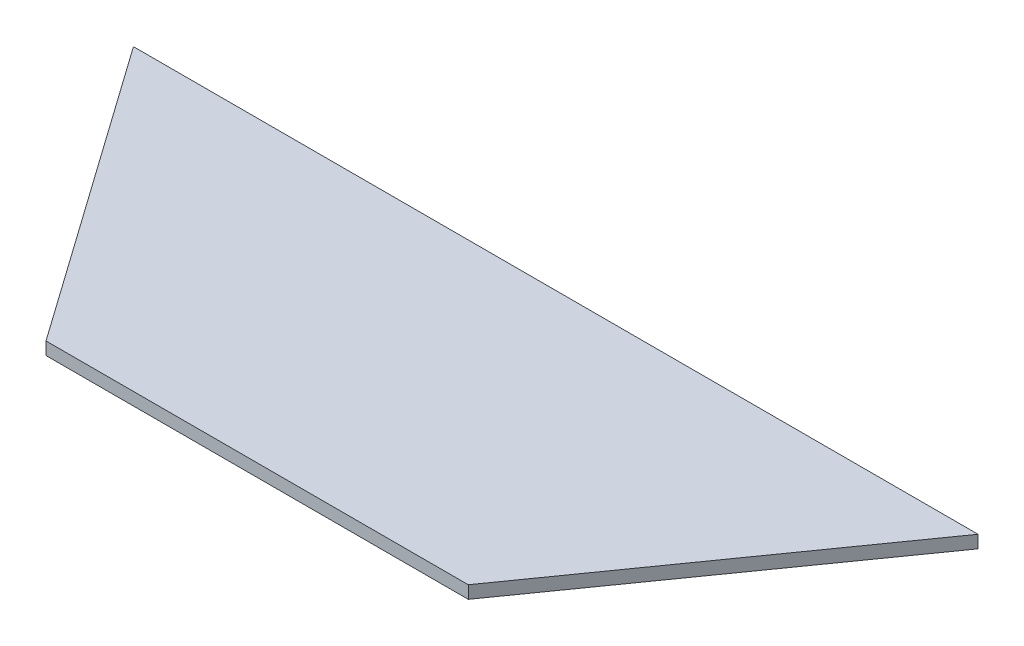
ISO-10303-21;
HEADER;
FILE_DESCRIPTION(('STEP AP214'),'2;1');
FILE_NAME('part.step','',(''),(''),'','','');
FILE_SCHEMA(('AUTOMOTIVE_DESIGN { 1 0 10303 214 1 1 1 1 }'));
ENDSEC;
DATA;
#1=APPLICATION_CONTEXT('core data for automotive mechanical design processes');
#2=APPLICATION_PROTOCOL_DEFINITION('international standard','automotive_design',2000,#1);
#3=PRODUCT_CONTEXT('',#1,'mechanical');
#4=PRODUCT('Part','Part','',(#3));
#5=PRODUCT_RELATED_PRODUCT_CATEGORY('part','',(#4));
#6=PRODUCT_DEFINITION_FORMATION('','',#4);
#7=PRODUCT_DEFINITION_CONTEXT('part definition',#1,'design');
#8=PRODUCT_DEFINITION('design','',#6,#7);
#9=PRODUCT_DEFINITION_SHAPE('','',#8);
#10=(LENGTH_UNIT() NAMED_UNIT(*) SI_UNIT(.MILLI.,.METRE.));
#11=(NAMED_UNIT(*) PLANE_ANGLE_UNIT() SI_UNIT($,.RADIAN.));
#12=(NAMED_UNIT(*) SI_UNIT($,.STERADIAN.) SOLID_ANGLE_UNIT());
#13=UNCERTAINTY_MEASURE_WITH_UNIT(LENGTH_MEASURE(1.E-05),#10,'distance_accuracy_value','');
#14=(GEOMETRIC_REPRESENTATION_CONTEXT(3) GLOBAL_UNCERTAINTY_ASSIGNED_CONTEXT((#13)) GLOBAL_UNIT_ASSIGNED_CONTEXT((#10,
#11,#12)) REPRESENTATION_CONTEXT('',''));
#15=CARTESIAN_POINT('',(0.,0.,0.));
#16=DIRECTION('',(0.,0.,1.));
#17=DIRECTION('',(1.,0.,0.));
#18=AXIS2_PLACEMENT_3D('',#15,#16,#17);
#19=CARTESIAN_POINT('',(50.,1.5,-35.3553390593274));
#20=DIRECTION('',(-0.816496580927726,0.,-0.577350269189626));
#21=DIRECTION('',(-0.577350269189626,0.,0.816496580927726));
#22=AXIS2_PLACEMENT_3D('',#19,#20,#21);
#23=PLANE('',#22);
#24=DIRECTION('',(0.577350269189626,0.,-0.816496580927726));
#25=VECTOR('',#24,1.);
#26=CARTESIAN_POINT('',(50.,0.,-35.3553390593274));
#27=LINE('',#26,#25);
#28=CARTESIAN_POINT('',(25.,0.,0.));
#29=VERTEX_POINT('',#28);
#30=CARTESIAN_POINT('',(50.,0.,-35.3553390593274));
#31=VERTEX_POINT('',#30);
#32=EDGE_CURVE('E110',#29,#31,#27,.T.);
#33=ORIENTED_EDGE('',*,*,#32,.T.);
#34=DIRECTION('',(0.,-1.,0.));
#35=VECTOR('',#34,1.);
#36=CARTESIAN_POINT('',(50.,1.5,-35.3553390593274));
#37=LINE('',#36,#35);
#38=CARTESIAN_POINT('',(50.,1.5,-35.3553390593274));
#39=VERTEX_POINT('',#38);
#40=EDGE_CURVE('E11',#39,#31,#37,.T.);
#41=ORIENTED_EDGE('',*,*,#40,.F.);
#42=DIRECTION('',(0.577350269189626,0.,-0.816496580927726));
#43=VECTOR('',#42,1.);
#44=CARTESIAN_POINT('',(50.,1.5,-35.3553390593274));
#45=LINE('',#44,#43);
#46=CARTESIAN_POINT('',(25.,1.5,0.));
#47=VERTEX_POINT('',#46);
#48=EDGE_CURVE('E93',#47,#39,#45,.T.);
#49=ORIENTED_EDGE('',*,*,#48,.F.);
#50=DIRECTION('',(0.,-1.,0.));
#51=VECTOR('',#50,1.);
#52=CARTESIAN_POINT('',(25.,1.5,0.));
#53=LINE('',#52,#51);
#54=EDGE_CURVE('E106',#47,#29,#53,.T.);
#55=ORIENTED_EDGE('',*,*,#54,.T.);
#56=EDGE_LOOP('',(#33,#41,#49,#55));
#57=FACE_BOUND('',#56,.T.);
#58=ADVANCED_FACE('F41',(#57),#23,.F.);
#59=CARTESIAN_POINT('',(50.,1.5,-35.3553390593274));
#60=DIRECTION('',(0.,0.,1.));
#61=DIRECTION('',(1.,0.,0.));
#62=AXIS2_PLACEMENT_3D('',#59,#60,#61);
#63=PLANE('',#62);
#64=DIRECTION('',(-1.,0.,0.));
#65=VECTOR('',#64,1.);
#66=CARTESIAN_POINT('',(50.,0.,-35.3553390593274));
#67=LINE('',#66,#65);
#68=CARTESIAN_POINT('',(-50.,0.,-35.3553390593274));
#69=VERTEX_POINT('',#68);
#70=EDGE_CURVE('E98',#31,#69,#67,.T.);
#71=ORIENTED_EDGE('',*,*,#70,.T.);
#72=DIRECTION('',(0.,-1.,0.));
#73=VECTOR('',#72,1.);
#74=CARTESIAN_POINT('',(-50.,1.5,-35.3553390593274));
#75=LINE('',#74,#73);
#76=CARTESIAN_POINT('',(-50.,1.5,-35.3553390593274));
#77=VERTEX_POINT('',#76);
#78=EDGE_CURVE('E50',#77,#69,#75,.T.);
#79=ORIENTED_EDGE('',*,*,#78,.F.);
#80=DIRECTION('',(-1.,0.,0.));
#81=VECTOR('',#80,1.);
#82=CARTESIAN_POINT('',(50.,1.5,-35.3553390593274));
#83=LINE('',#82,#81);
#84=EDGE_CURVE('E88',#39,#77,#83,.T.);
#85=ORIENTED_EDGE('',*,*,#84,.F.);
#86=ORIENTED_EDGE('',*,*,#40,.T.);
#87=EDGE_LOOP('',(#71,#79,#85,#86));
#88=FACE_BOUND('',#87,.T.);
#89=ADVANCED_FACE('F97',(#88),#63,.F.);
#90=CARTESIAN_POINT('',(-50.,1.5,-35.3553390593274));
#91=DIRECTION('',(0.816496580927726,0.,-0.577350269189626));
#92=DIRECTION('',(-0.577350269189626,0.,-0.816496580927726));
#93=AXIS2_PLACEMENT_3D('',#90,#91,#92);
#94=PLANE('',#93);
#95=DIRECTION('',(0.577350269189626,0.,0.816496580927726));
#96=VECTOR('',#95,1.);
#97=CARTESIAN_POINT('',(-50.,0.,-35.3553390593274));
#98=LINE('',#97,#96);
#99=CARTESIAN_POINT('',(-25.,0.,0.));
#100=VERTEX_POINT('',#99);
#101=EDGE_CURVE('E75',#69,#100,#98,.T.);
#102=ORIENTED_EDGE('',*,*,#101,.T.);
#103=DIRECTION('',(0.,-1.,0.));
#104=VECTOR('',#103,1.);
#105=CARTESIAN_POINT('',(-25.,1.5,0.));
#106=LINE('',#105,#104);
#107=CARTESIAN_POINT('',(-25.,1.5,0.));
#108=VERTEX_POINT('',#107);
#109=EDGE_CURVE('E100',#108,#100,#106,.T.);
#110=ORIENTED_EDGE('',*,*,#109,.F.);
#111=DIRECTION('',(0.577350269189626,0.,0.816496580927726));
#112=VECTOR('',#111,1.);
#113=CARTESIAN_POINT('',(-50.,1.5,-35.3553390593274));
#114=LINE('',#113,#112);
#115=EDGE_CURVE('E91',#77,#108,#114,.T.);
#116=ORIENTED_EDGE('',*,*,#115,.F.);
#117=ORIENTED_EDGE('',*,*,#78,.T.);
#118=EDGE_LOOP('',(#102,#110,#116,#117));
#119=FACE_BOUND('',#118,.T.);
#120=ADVANCED_FACE('F101',(#119),#94,.F.);
#121=CARTESIAN_POINT('',(25.,1.5,0.));
#122=DIRECTION('',(0.,0.,-1.));
#123=DIRECTION('',(-1.,0.,0.));
#124=AXIS2_PLACEMENT_3D('',#121,#122,#123);
#125=PLANE('',#124);
#126=DIRECTION('',(1.,0.,0.));
#127=VECTOR('',#126,1.);
#128=CARTESIAN_POINT('',(25.,0.,0.));
#129=LINE('',#128,#127);
#130=EDGE_CURVE('E81',#100,#29,#129,.T.);
#131=ORIENTED_EDGE('',*,*,#130,.T.);
#132=ORIENTED_EDGE('',*,*,#54,.F.);
#133=DIRECTION('',(1.,0.,0.));
#134=VECTOR('',#133,1.);
#135=CARTESIAN_POINT('',(25.,1.5,0.));
#136=LINE('',#135,#134);
#137=EDGE_CURVE('E58',#108,#47,#136,.T.);
#138=ORIENTED_EDGE('',*,*,#137,.F.);
#139=ORIENTED_EDGE('',*,*,#109,.T.);
#140=EDGE_LOOP('',(#131,#132,#138,#139));
#141=FACE_BOUND('',#140,.T.);
#142=ADVANCED_FACE('F124',(#141),#125,.F.);
#143=CARTESIAN_POINT('',(0.,1.5,0.));
#144=DIRECTION('',(0.,1.,0.));
#145=DIRECTION('',(0.,0.,1.));
#146=AXIS2_PLACEMENT_3D('',#143,#144,#145);
#147=PLANE('',#146);
#148=ORIENTED_EDGE('',*,*,#48,.T.);
#149=ORIENTED_EDGE('',*,*,#84,.T.);
#150=ORIENTED_EDGE('',*,*,#115,.T.);
#151=ORIENTED_EDGE('',*,*,#137,.T.);
#152=EDGE_LOOP('',(#148,#149,#150,#151));
#153=FACE_BOUND('',#152,.T.);
#154=ADVANCED_FACE('F89',(#153),#147,.T.);
#155=CARTESIAN_POINT('',(0.,0.,0.));
#156=DIRECTION('',(0.,1.,0.));
#157=DIRECTION('',(0.,0.,1.));
#158=AXIS2_PLACEMENT_3D('',#155,#156,#157);
#159=PLANE('',#158);
#160=ORIENTED_EDGE('',*,*,#32,.F.);
#161=ORIENTED_EDGE('',*,*,#130,.F.);
#162=ORIENTED_EDGE('',*,*,#101,.F.);
#163=ORIENTED_EDGE('',*,*,#70,.F.);
#164=EDGE_LOOP('',(#160,#161,#162,#163));
#165=FACE_BOUND('',#164,.T.);
#166=ADVANCED_FACE('F127',(#165),#159,.F.);
#167=CLOSED_SHELL('',(#58,#89,#120,#142,#154,#166));
#168=MANIFOLD_SOLID_BREP('B2',#167);
#169=ADVANCED_BREP_SHAPE_REPRESENTATION('',(#18,#168),#14);
#170=SHAPE_DEFINITION_REPRESENTATION(#9,#169);
ENDSEC;
END-ISO-10303-21;
